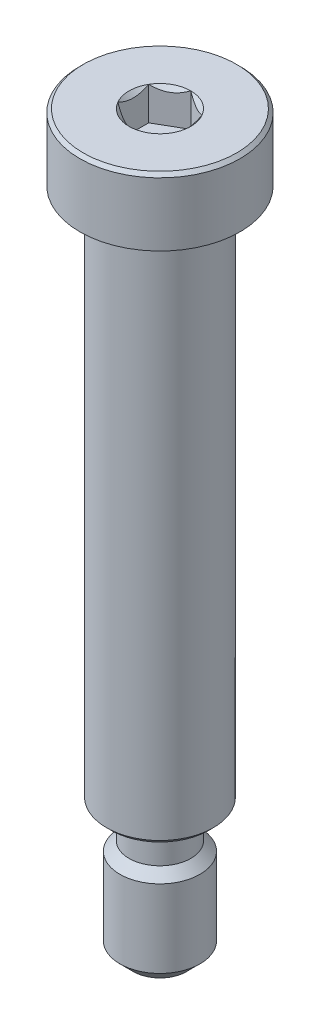
ISO-10303-21;
HEADER;
FILE_DESCRIPTION(('STEP AP214'),'2;1');
FILE_NAME('part.step','',(''),(''),'','','');
FILE_SCHEMA(('AUTOMOTIVE_DESIGN { 1 0 10303 214 1 1 1 1 }'));
ENDSEC;
DATA;
#1=APPLICATION_CONTEXT('core data for automotive mechanical design processes');
#2=APPLICATION_PROTOCOL_DEFINITION('international standard','automotive_design',2000,#1);
#3=PRODUCT_CONTEXT('',#1,'mechanical');
#4=PRODUCT('Part','Part','',(#3));
#5=PRODUCT_RELATED_PRODUCT_CATEGORY('part','',(#4));
#6=PRODUCT_DEFINITION_FORMATION('','',#4);
#7=PRODUCT_DEFINITION_CONTEXT('part definition',#1,'design');
#8=PRODUCT_DEFINITION('design','',#6,#7);
#9=PRODUCT_DEFINITION_SHAPE('','',#8);
#10=(LENGTH_UNIT() NAMED_UNIT(*) SI_UNIT(.MILLI.,.METRE.));
#11=(NAMED_UNIT(*) PLANE_ANGLE_UNIT() SI_UNIT($,.RADIAN.));
#12=(NAMED_UNIT(*) SI_UNIT($,.STERADIAN.) SOLID_ANGLE_UNIT());
#13=UNCERTAINTY_MEASURE_WITH_UNIT(LENGTH_MEASURE(1.E-05),#10,'distance_accuracy_value','');
#14=(GEOMETRIC_REPRESENTATION_CONTEXT(3) GLOBAL_UNCERTAINTY_ASSIGNED_CONTEXT((#13)) GLOBAL_UNIT_ASSIGNED_CONTEXT((#10,
#11,#12)) REPRESENTATION_CONTEXT('',''));
#15=CARTESIAN_POINT('',(0.,0.,0.));
#16=DIRECTION('',(0.,0.,1.));
#17=DIRECTION('',(1.,0.,0.));
#18=AXIS2_PLACEMENT_3D('',#15,#16,#17);
#19=CARTESIAN_POINT('',(0.,-79.375,0.));
#20=DIRECTION('',(0.,1.,0.));
#21=DIRECTION('',(0.,0.,1.));
#22=AXIS2_PLACEMENT_3D('',#19,#20,#21);
#23=CYLINDRICAL_SURFACE('',#22,4.7625);
#24=CARTESIAN_POINT('',(0.,-63.5,0.));
#25=DIRECTION('',(0.,-1.,0.));
#26=DIRECTION('',(0.,0.,-1.));
#27=AXIS2_PLACEMENT_3D('',#24,#25,#26);
#28=CIRCLE('',#27,4.7625);
#29=CARTESIAN_POINT('',(0.,-63.5,-4.7625));
#30=VERTEX_POINT('',#29);
#31=EDGE_CURVE('E244',#30,#30,#28,.T.);
#32=ORIENTED_EDGE('',*,*,#31,.T.);
#33=EDGE_LOOP('',(#32));
#34=FACE_BOUND('',#33,.T.);
#35=CARTESIAN_POINT('',(0.,-63.5042322831476,0.));
#36=DIRECTION('',(0.,-1.,0.));
#37=DIRECTION('',(1.,0.,0.));
#38=AXIS2_PLACEMENT_3D('',#35,#36,#37);
#39=CIRCLE('',#38,4.7625);
#40=CARTESIAN_POINT('',(4.76250000000001,-63.5042322831476,0.));
#41=VERTEX_POINT('',#40);
#42=EDGE_CURVE('E240',#41,#41,#39,.T.);
#43=ORIENTED_EDGE('',*,*,#42,.F.);
#44=EDGE_LOOP('',(#43));
#45=FACE_BOUND('',#44,.T.);
#46=ADVANCED_FACE('F34',(#34,#45),#23,.T.);
#47=CARTESIAN_POINT('',(0.,-63.5,0.));
#48=DIRECTION('',(0.,-1.,0.));
#49=DIRECTION('',(0.,0.,-1.));
#50=AXIS2_PLACEMENT_3D('',#47,#48,#49);
#51=PLANE('',#50);
#52=CARTESIAN_POINT('',(0.,-63.5,0.));
#53=DIRECTION('',(0.,-1.,0.));
#54=DIRECTION('',(0.,0.,-1.));
#55=AXIS2_PLACEMENT_3D('',#52,#53,#54);
#56=CIRCLE('',#55,5.82083333333334);
#57=CARTESIAN_POINT('',(0.,-63.5,-5.82083333333334));
#58=VERTEX_POINT('',#57);
#59=EDGE_CURVE('E251',#58,#58,#56,.T.);
#60=ORIENTED_EDGE('',*,*,#59,.T.);
#61=EDGE_LOOP('',(#60));
#62=FACE_BOUND('',#61,.T.);
#63=ORIENTED_EDGE('',*,*,#31,.F.);
#64=EDGE_LOOP('',(#63));
#65=FACE_BOUND('',#64,.T.);
#66=ADVANCED_FACE('F208',(#62,#65),#51,.T.);
#67=CARTESIAN_POINT('',(0.,7.9375,0.));
#68=DIRECTION('',(0.,-1.,0.));
#69=DIRECTION('',(0.,0.,-1.));
#70=AXIS2_PLACEMENT_3D('',#67,#68,#69);
#71=CYLINDRICAL_SURFACE('',#70,9.525);
#72=CARTESIAN_POINT('',(0.,7.540625,0.));
#73=DIRECTION('',(0.,1.,0.));
#74=DIRECTION('',(0.,0.,1.));
#75=AXIS2_PLACEMENT_3D('',#72,#73,#74);
#76=CIRCLE('',#75,9.525);
#77=CARTESIAN_POINT('',(0.,7.540625,9.525));
#78=VERTEX_POINT('',#77);
#79=EDGE_CURVE('E11',#78,#78,#76,.F.);
#80=ORIENTED_EDGE('',*,*,#79,.T.);
#81=EDGE_LOOP('',(#80));
#82=FACE_BOUND('',#81,.T.);
#83=CARTESIAN_POINT('',(0.,0.,0.));
#84=DIRECTION('',(0.,1.,0.));
#85=DIRECTION('',(0.,0.,1.));
#86=AXIS2_PLACEMENT_3D('',#83,#84,#85);
#87=CIRCLE('',#86,9.525);
#88=CARTESIAN_POINT('',(0.,0.,9.525));
#89=VERTEX_POINT('',#88);
#90=EDGE_CURVE('E106',#89,#89,#87,.T.);
#91=ORIENTED_EDGE('',*,*,#90,.T.);
#92=EDGE_LOOP('',(#91));
#93=FACE_BOUND('',#92,.T.);
#94=ADVANCED_FACE('F215',(#82,#93),#71,.T.);
#95=CARTESIAN_POINT('',(0.,7.9375,0.));
#96=DIRECTION('',(0.,1.,0.));
#97=DIRECTION('',(0.,0.,1.));
#98=AXIS2_PLACEMENT_3D('',#95,#96,#97);
#99=PLANE('',#98);
#100=CARTESIAN_POINT('',(0.,7.9375,0.));
#101=DIRECTION('',(0.,1.,0.));
#102=DIRECTION('',(0.,0.,1.));
#103=AXIS2_PLACEMENT_3D('',#100,#101,#102);
#104=CIRCLE('',#103,9.128125);
#105=CARTESIAN_POINT('',(0.,7.9375,9.128125));
#106=VERTEX_POINT('',#105);
#107=EDGE_CURVE('E42',#106,#106,#104,.T.);
#108=ORIENTED_EDGE('',*,*,#107,.T.);
#109=EDGE_LOOP('',(#108));
#110=FACE_BOUND('',#109,.T.);
#111=CARTESIAN_POINT('',(0.,7.9375,0.));
#112=DIRECTION('',(0.,1.,0.));
#113=DIRECTION('',(0.,0.,1.));
#114=AXIS2_PLACEMENT_3D('',#111,#112,#113);
#115=CIRCLE('',#114,3.66617420935412);
#116=CARTESIAN_POINT('',(0.,7.9375,3.66617420935412));
#117=VERTEX_POINT('',#116);
#118=CARTESIAN_POINT('',(3.175,7.9375,1.83308710467706));
#119=VERTEX_POINT('',#118);
#120=EDGE_CURVE('E55',#117,#119,#115,.T.);
#121=ORIENTED_EDGE('',*,*,#120,.F.);
#122=CARTESIAN_POINT('',(-3.175,7.9375,1.83308710467706));
#123=VERTEX_POINT('',#122);
#124=EDGE_CURVE('E130',#123,#117,#115,.T.);
#125=ORIENTED_EDGE('',*,*,#124,.F.);
#126=CARTESIAN_POINT('',(-3.175,7.9375,-1.83308710467706));
#127=VERTEX_POINT('',#126);
#128=EDGE_CURVE('E129',#127,#123,#115,.T.);
#129=ORIENTED_EDGE('',*,*,#128,.F.);
#130=CARTESIAN_POINT('',(0.,7.9375,-3.66617420935412));
#131=VERTEX_POINT('',#130);
#132=EDGE_CURVE('E95',#131,#127,#115,.T.);
#133=ORIENTED_EDGE('',*,*,#132,.F.);
#134=CARTESIAN_POINT('',(3.175,7.9375,-1.83308710467706));
#135=VERTEX_POINT('',#134);
#136=EDGE_CURVE('E87',#135,#131,#115,.T.);
#137=ORIENTED_EDGE('',*,*,#136,.F.);
#138=EDGE_CURVE('E48',#119,#135,#115,.T.);
#139=ORIENTED_EDGE('',*,*,#138,.F.);
#140=EDGE_LOOP('',(#121,#125,#129,#133,#137,#139));
#141=FACE_BOUND('',#140,.T.);
#142=ADVANCED_FACE('F126',(#110,#141),#99,.T.);
#143=CARTESIAN_POINT('',(0.,0.,0.));
#144=DIRECTION('',(0.,1.,0.));
#145=DIRECTION('',(0.,0.,1.));
#146=AXIS2_PLACEMENT_3D('',#143,#144,#145);
#147=PLANE('',#146);
#148=CARTESIAN_POINT('',(0.,0.,0.));
#149=DIRECTION('',(0.,-1.,0.));
#150=DIRECTION('',(0.,0.,-1.));
#151=AXIS2_PLACEMENT_3D('',#148,#149,#150);
#152=CIRCLE('',#151,6.35);
#153=CARTESIAN_POINT('',(0.,0.,-6.35));
#154=VERTEX_POINT('',#153);
#155=EDGE_CURVE('E134',#154,#154,#152,.T.);
#156=ORIENTED_EDGE('',*,*,#155,.F.);
#157=EDGE_LOOP('',(#156));
#158=FACE_BOUND('',#157,.T.);
#159=ORIENTED_EDGE('',*,*,#90,.F.);
#160=EDGE_LOOP('',(#159));
#161=FACE_BOUND('',#160,.T.);
#162=ADVANCED_FACE('F400',(#158,#161),#147,.F.);
#163=CARTESIAN_POINT('',(0.,7.9375,0.));
#164=DIRECTION('',(0.,1.,0.));
#165=DIRECTION('',(0.,0.,1.));
#166=AXIS2_PLACEMENT_3D('',#163,#164,#165);
#167=CONICAL_SURFACE('',#166,3.66617420935412,0.78539816339745);
#168=ORIENTED_EDGE('',*,*,#132,.T.);
#169=CARTESIAN_POINT('',(0.000199999999998715,7.93761547550894,-3.66628967940796));
#170=CARTESIAN_POINT('',(-0.108938349949827,7.87465898369178,-3.60327862368552));
#171=CARTESIAN_POINT('',(-0.219901628077946,7.81540010423474,-3.53921394518808));
#172=CARTESIAN_POINT('',(-0.446167846345947,7.70689865573056,-3.40857908316254));
#173=CARTESIAN_POINT('',(-0.561492303252263,7.65771645393871,-3.34199647692353));
#174=CARTESIAN_POINT('',(-0.794038522480625,7.573466458874,-3.207735854653));
#175=CARTESIAN_POINT('',(-0.911201066281149,7.53818691449945,-3.14009202845083));
#176=CARTESIAN_POINT('',(-1.14810544464628,7.48383157013482,-3.00331522182952));
#177=CARTESIAN_POINT('',(-1.26784004264355,7.46471519752964,-2.93418641944448));
#178=CARTESIAN_POINT('',(-1.47419791875158,7.44746713062325,-2.81504564412411));
#179=CARTESIAN_POINT('',(-1.56055470772915,7.44491393361382,-2.76518752876156));
#180=CARTESIAN_POINT('',(-1.73312781652471,7.44921627312326,-2.66555239794355));
#181=CARTESIAN_POINT('',(-1.8193440764928,7.45607510802144,-2.61577541704245));
#182=CARTESIAN_POINT('',(-1.99095979158713,7.4788098833037,-2.51669303773557));
#183=CARTESIAN_POINT('',(-2.07635822425327,7.49469590968728,-2.4673882296474));
#184=CARTESIAN_POINT('',(-2.24568840330547,7.53461798399795,-2.36962540518969));
#185=CARTESIAN_POINT('',(-2.32962026161975,7.55865340708517,-2.32116732419836));
#186=CARTESIAN_POINT('',(-2.47862357928411,7.60810523441716,-2.23514021863469));
#187=CARTESIAN_POINT('',(-2.54402485119173,7.63222171930099,-2.19738077669348));
#188=CARTESIAN_POINT('',(-2.67365325020511,7.68434146713715,-2.12253978562849));
#189=CARTESIAN_POINT('',(-2.73788034144172,7.71234484860353,-2.08545825721376));
#190=CARTESIAN_POINT('',(-2.8649580345126,7.77161056554451,-2.01208991691129));
#191=CARTESIAN_POINT('',(-2.92781225074872,7.80286265335421,-1.97580101824766));
#192=CARTESIAN_POINT('',(-3.05235662084809,7.86821534439193,-1.90389529264474));
#193=CARTESIAN_POINT('',(-3.11404746097871,7.90231419951854,-1.86827806948879));
#194=CARTESIAN_POINT('',(-3.1752,7.93761547550894,-1.83297163462322));
#195=B_SPLINE_CURVE_WITH_KNOTS('',3,(#169,#170,#171,#172,#173,#174,#175,#176,#177,#178,#179,
#180,#181,#182,#183,#184,#185,#186,#187,#188,#189,#190,#191,#192,#193,#194),.UNSPECIFIED.,.F.,
.F.,(4,2,2,2,2,2,2,2,2,2,2,2,4),(0.,0.422910572436807,0.848285055427806,1.26690402276127,
1.68446903107506,1.98329272958351,2.2822211754689,2.58148426995465,2.88072442418451,
3.11844134429546,3.35616551414405,3.59316134346766,3.83001269744429),.UNSPECIFIED.);
#196=EDGE_CURVE('E100',#131,#127,#195,.T.);
#197=ORIENTED_EDGE('',*,*,#196,.F.);
#198=EDGE_LOOP('',(#168,#197));
#199=FACE_BOUND('',#198,.T.);
#200=ADVANCED_FACE('F101',(#199),#167,.F.);
#201=ORIENTED_EDGE('',*,*,#128,.T.);
#202=CARTESIAN_POINT('',(-3.175,8.99520369961384,-3.49777036107798));
#203=CARTESIAN_POINT('',(-3.175,8.93160162531257,-3.41185351747915));
#204=CARTESIAN_POINT('',(-3.175,8.86866125375686,-3.32543845851566));
#205=CARTESIAN_POINT('',(-3.175,8.74439421336915,-3.15142240756836));
#206=CARTESIAN_POINT('',(-3.175,8.6830679776502,-3.06382110664582));
#207=CARTESIAN_POINT('',(-3.175,8.56188558427659,-2.88660407918384));
#208=CARTESIAN_POINT('',(-3.175,8.50204451400587,-2.79697799945208));
#209=CARTESIAN_POINT('',(-3.175,8.38475317061914,-2.61617950744609));
#210=CARTESIAN_POINT('',(-3.175,8.32730272356863,-2.52500720835187));
#211=CARTESIAN_POINT('',(-3.175,8.2124324313803,-2.33615109320517));
#212=CARTESIAN_POINT('',(-3.175,8.15516599624618,-2.23837348539621));
#213=CARTESIAN_POINT('',(-3.175,8.04462077200859,-2.04055386532052));
#214=CARTESIAN_POINT('',(-3.175,7.99134266036117,-1.94051147209944));
#215=CARTESIAN_POINT('',(-3.175,7.88994212127888,-1.73821620522712));
#216=CARTESIAN_POINT('',(-3.175,7.84180419911621,-1.6359711596194));
#217=CARTESIAN_POINT('',(-3.175,7.75174978873241,-1.42878409167596));
#218=CARTESIAN_POINT('',(-3.175,7.70983137866185,-1.32384291426178));
#219=CARTESIAN_POINT('',(-3.175,7.63602565680179,-1.11770217875831));
#220=CARTESIAN_POINT('',(-3.175,7.60368058955801,-1.01666827859361));
#221=CARTESIAN_POINT('',(-3.175,7.54712119127079,-0.812306588419582));
#222=CARTESIAN_POINT('',(-3.175,7.52290746724818,-0.708978627767683));
#223=CARTESIAN_POINT('',(-3.175,7.48423721095156,-0.502291088296213));
#224=CARTESIAN_POINT('',(-3.175,7.46962275371737,-0.398961533288926));
#225=CARTESIAN_POINT('',(-3.175,7.45041014576881,-0.191370983762266));
#226=CARTESIAN_POINT('',(-3.175,7.44581056767828,-0.0871101241047789));
#227=CARTESIAN_POINT('',(-3.175,7.44691649491753,0.118225105111013));
#228=CARTESIAN_POINT('',(-3.175,7.45231710556286,0.21930127075547));
#229=CARTESIAN_POINT('',(-3.175,7.47248589256745,0.420508629839324));
#230=CARTESIAN_POINT('',(-3.175,7.48725502370013,0.520639725908214));
#231=CARTESIAN_POINT('',(-3.175,7.5256342754121,0.720923459793612));
#232=CARTESIAN_POINT('',(-3.175,7.54938964901744,0.821047839628115));
#233=CARTESIAN_POINT('',(-3.175,7.6045221397412,1.01913191673953));
#234=CARTESIAN_POINT('',(-3.175,7.63589843825639,1.1170918452793));
#235=CARTESIAN_POINT('',(-3.175,7.70962924077272,1.32355745229036));
#236=CARTESIAN_POINT('',(-3.175,7.7528880801131,1.43173730319367));
#237=CARTESIAN_POINT('',(-3.175,7.84598518904404,1.64523596826605));
#238=CARTESIAN_POINT('',(-3.175,7.89582577223603,1.75055376059988));
#239=CARTESIAN_POINT('',(-3.175,8.00090274785494,1.95888658964307));
#240=CARTESIAN_POINT('',(-3.175,8.05615677118685,2.06189266220424));
#241=CARTESIAN_POINT('',(-3.175,8.1708303110691,2.26552135685404));
#242=CARTESIAN_POINT('',(-3.175,8.23024913945364,2.36614436904551));
#243=CARTESIAN_POINT('',(-3.175,8.34934693008608,2.56031406522809));
#244=CARTESIAN_POINT('',(-3.175,8.4088619425535,2.6539618438625));
#245=CARTESIAN_POINT('',(-3.175,8.53035388120396,2.83965181917168));
#246=CARTESIAN_POINT('',(-3.175,8.59233099581655,2.93169389217982));
#247=CARTESIAN_POINT('',(-3.175,8.71778495380937,3.11362922655354));
#248=CARTESIAN_POINT('',(-3.175,8.78124524746769,3.20353394064091));
#249=CARTESIAN_POINT('',(-3.175,8.90981361559042,3.38212136637414));
#250=CARTESIAN_POINT('',(-3.175,8.97492123418763,3.47080440582776));
#251=CARTESIAN_POINT('',(-3.175,9.0407012939609,3.55897705691137));
#252=B_SPLINE_CURVE_WITH_KNOTS('',3,(#202,#203,#204,#205,#206,#207,#208,#209,#210,#211,#212,
#213,#214,#215,#216,#217,#218,#219,#220,#221,#222,#223,#224,#225,#226,#227,#228,#229,#230,#231,
#232,#233,#234,#235,#236,#237,#238,#239,#240,#241,#242,#243,#244,#245,#246,#247,#248,#249,#250,
#251),.UNSPECIFIED.,.F.,.F.,(4,2,2,2,2,2,2,2,2,2,2,2,2,2,2,2,2,2,2,2,2,2,2,2,4),(0.,
0.320697227131731,0.641479645775138,0.964749568744561,1.28799593030476,1.62786016473245,
1.96778199806988,2.30664837524686,2.64540982255861,2.96337986486636,3.28137363899217,
3.59399530687801,3.90657241527076,4.20977589426355,4.51301027857855,4.82137145114127,
5.12969951566147,5.47894757824494,5.82831873623607,6.178868176975,6.52935983108851,
6.86219199504095,7.19504968055625,7.52516675007628,7.85519344386229),.UNSPECIFIED.);
#253=EDGE_CURVE('E133',#127,#123,#252,.T.);
#254=ORIENTED_EDGE('',*,*,#253,.F.);
#255=EDGE_LOOP('',(#201,#254));
#256=FACE_BOUND('',#255,.T.);
#257=ADVANCED_FACE('F304',(#256),#167,.F.);
#258=ORIENTED_EDGE('',*,*,#124,.T.);
#259=CARTESIAN_POINT('',(-3.1752,7.93761547550895,1.83297163462322));
#260=CARTESIAN_POINT('',(-3.06606165005017,7.87465898369178,1.89598269034567));
#261=CARTESIAN_POINT('',(-2.95509837192205,7.81540010423474,1.9600473688431));
#262=CARTESIAN_POINT('',(-2.72883215365405,7.70689865573056,2.09068223086865));
#263=CARTESIAN_POINT('',(-2.61350769674774,7.65771645393871,2.15726483710766));
#264=CARTESIAN_POINT('',(-2.38096147751937,7.573466458874,2.29152545937818));
#265=CARTESIAN_POINT('',(-2.26379893371885,7.53818691449945,2.35916928558036));
#266=CARTESIAN_POINT('',(-2.02689455535372,7.48383157013482,2.49594609220167));
#267=CARTESIAN_POINT('',(-1.90715995735645,7.46471519752964,2.5650748945867));
#268=CARTESIAN_POINT('',(-1.70080208124842,7.44746713062325,2.68421566990707));
#269=CARTESIAN_POINT('',(-1.61444529227084,7.44491393361382,2.73407378526963));
#270=CARTESIAN_POINT('',(-1.44187218347528,7.44921627312326,2.83370891608763));
#271=CARTESIAN_POINT('',(-1.3556559235072,7.45607510802144,2.88348589698873));
#272=CARTESIAN_POINT('',(-1.18404020841287,7.4788098833037,2.98256827629561));
#273=CARTESIAN_POINT('',(-1.09864177574673,7.49469590968728,3.03187308438378));
#274=CARTESIAN_POINT('',(-0.929311596694526,7.53461798399795,3.1296359088415));
#275=CARTESIAN_POINT('',(-0.845379738380251,7.55865340708517,3.17809398983283));
#276=CARTESIAN_POINT('',(-0.696376420715884,7.60810523441716,3.2641210953965));
#277=CARTESIAN_POINT('',(-0.630975148808267,7.63222171930099,3.3018805373377));
#278=CARTESIAN_POINT('',(-0.501346749794892,7.68434146713715,3.3767215284027));
#279=CARTESIAN_POINT('',(-0.437119658558276,7.71234484860352,3.41380305681742));
#280=CARTESIAN_POINT('',(-0.310041965487399,7.77161056554451,3.48717139711989));
#281=CARTESIAN_POINT('',(-0.247187749251275,7.80286265335421,3.52346029578352));
#282=CARTESIAN_POINT('',(-0.122643379151906,7.86821534439193,3.59536602138644));
#283=CARTESIAN_POINT('',(-0.0609525390212896,7.90231419951854,3.63098324454239));
#284=CARTESIAN_POINT('',(0.000200000000000959,7.93761547550894,3.66628967940796));
#285=B_SPLINE_CURVE_WITH_KNOTS('',3,(#259,#260,#261,#262,#263,#264,#265,#266,#267,#268,#269,
#270,#271,#272,#273,#274,#275,#276,#277,#278,#279,#280,#281,#282,#283,#284),.UNSPECIFIED.,.F.,
.F.,(4,2,2,2,2,2,2,2,2,2,2,2,4),(0.,0.422910572436809,0.84828505542781,1.26690402276127,
1.68446903107506,1.98329272958352,2.2822211754689,2.58148426995466,2.88072442418452,
3.11844134429546,3.35616551414405,3.59316134346767,3.8300126974443),.UNSPECIFIED.);
#286=EDGE_CURVE('E144',#123,#117,#285,.T.);
#287=ORIENTED_EDGE('',*,*,#286,.F.);
#288=EDGE_LOOP('',(#258,#287));
#289=FACE_BOUND('',#288,.T.);
#290=ADVANCED_FACE('F302',(#289),#167,.F.);
#291=ORIENTED_EDGE('',*,*,#120,.T.);
#292=CARTESIAN_POINT('',(-0.000199999999998962,7.93761547550894,3.66628967940796));
#293=CARTESIAN_POINT('',(0.108938349949826,7.87465898369178,3.60327862368552));
#294=CARTESIAN_POINT('',(0.219901628077945,7.81540010423474,3.53921394518808));
#295=CARTESIAN_POINT('',(0.446167846345946,7.70689865573056,3.40857908316254));
#296=CARTESIAN_POINT('',(0.561492303252262,7.65771645393871,3.34199647692353));
#297=CARTESIAN_POINT('',(0.794038522480625,7.573466458874,3.207735854653));
#298=CARTESIAN_POINT('',(0.911201066281148,7.53818691449945,3.14009202845083));
#299=CARTESIAN_POINT('',(1.14810544464628,7.48383157013482,3.00331522182952));
#300=CARTESIAN_POINT('',(1.26784004264355,7.46471519752964,2.93418641944448));
#301=CARTESIAN_POINT('',(1.47419791875158,7.44746713062325,2.81504564412411));
#302=CARTESIAN_POINT('',(1.56055470772915,7.44491393361382,2.76518752876156));
#303=CARTESIAN_POINT('',(1.73312781652471,7.44921627312326,2.66555239794355));
#304=CARTESIAN_POINT('',(1.8193440764928,7.45607510802144,2.61577541704245));
#305=CARTESIAN_POINT('',(1.99095979158713,7.4788098833037,2.51669303773558));
#306=CARTESIAN_POINT('',(2.07635822425327,7.49469590968728,2.4673882296474));
#307=CARTESIAN_POINT('',(2.24568840330547,7.53461798399795,2.36962540518969));
#308=CARTESIAN_POINT('',(2.32962026161975,7.55865340708517,2.32116732419836));
#309=CARTESIAN_POINT('',(2.47862357928411,7.60810523441716,2.23514021863469));
#310=CARTESIAN_POINT('',(2.54402485119173,7.63222171930099,2.19738077669348));
#311=CARTESIAN_POINT('',(2.6736532502051,7.68434146713715,2.12253978562849));
#312=CARTESIAN_POINT('',(2.73788034144172,7.71234484860353,2.08545825721376));
#313=CARTESIAN_POINT('',(2.8649580345126,7.77161056554451,2.01208991691129));
#314=CARTESIAN_POINT('',(2.92781225074872,7.80286265335421,1.97580101824766));
#315=CARTESIAN_POINT('',(3.05235662084809,7.86821534439193,1.90389529264474));
#316=CARTESIAN_POINT('',(3.11404746097871,7.90231419951854,1.86827806948879));
#317=CARTESIAN_POINT('',(3.1752,7.93761547550894,1.83297163462322));
#318=B_SPLINE_CURVE_WITH_KNOTS('',3,(#292,#293,#294,#295,#296,#297,#298,#299,#300,#301,#302,
#303,#304,#305,#306,#307,#308,#309,#310,#311,#312,#313,#314,#315,#316,#317),.UNSPECIFIED.,.F.,
.F.,(4,2,2,2,2,2,2,2,2,2,2,2,4),(0.,0.422910572436807,0.848285055427806,1.26690402276127,
1.68446903107506,1.98329272958351,2.2822211754689,2.58148426995465,2.88072442418451,
3.11844134429546,3.35616551414405,3.59316134346766,3.8300126974443),.UNSPECIFIED.);
#319=EDGE_CURVE('E174',#117,#119,#318,.T.);
#320=ORIENTED_EDGE('',*,*,#319,.F.);
#321=EDGE_LOOP('',(#291,#320));
#322=FACE_BOUND('',#321,.T.);
#323=ADVANCED_FACE('F430',(#322),#167,.F.);
#324=ORIENTED_EDGE('',*,*,#138,.T.);
#325=CARTESIAN_POINT('',(3.175,8.99520369961384,-3.49777036107798));
#326=CARTESIAN_POINT('',(3.175,8.93160162531257,-3.41185351747915));
#327=CARTESIAN_POINT('',(3.175,8.86866125375686,-3.32543845851566));
#328=CARTESIAN_POINT('',(3.175,8.74439421336915,-3.15142240756837));
#329=CARTESIAN_POINT('',(3.175,8.6830679776502,-3.06382110664582));
#330=CARTESIAN_POINT('',(3.175,8.56188558427659,-2.88660407918385));
#331=CARTESIAN_POINT('',(3.175,8.50204451400588,-2.79697799945208));
#332=CARTESIAN_POINT('',(3.175,8.38475317061914,-2.6161795074461));
#333=CARTESIAN_POINT('',(3.175,8.32730272356864,-2.52500720835187));
#334=CARTESIAN_POINT('',(3.175,8.2124324313803,-2.33615109320517));
#335=CARTESIAN_POINT('',(3.175,8.15516599624618,-2.23837348539621));
#336=CARTESIAN_POINT('',(3.175,8.0446207720086,-2.04055386532052));
#337=CARTESIAN_POINT('',(3.175,7.99134266036117,-1.94051147209944));
#338=CARTESIAN_POINT('',(3.175,7.88994212127888,-1.73821620522712));
#339=CARTESIAN_POINT('',(3.175,7.84180419911621,-1.6359711596194));
#340=CARTESIAN_POINT('',(3.175,7.75174978873241,-1.42878409167596));
#341=CARTESIAN_POINT('',(3.175,7.70983137866185,-1.32384291426178));
#342=CARTESIAN_POINT('',(3.175,7.63602565680179,-1.11770217875831));
#343=CARTESIAN_POINT('',(3.175,7.60368058955801,-1.01666827859361));
#344=CARTESIAN_POINT('',(3.175,7.54712119127079,-0.812306588419583));
#345=CARTESIAN_POINT('',(3.175,7.52290746724818,-0.708978627767684));
#346=CARTESIAN_POINT('',(3.175,7.48423721095156,-0.502291088296214));
#347=CARTESIAN_POINT('',(3.175,7.46962275371737,-0.398961533288927));
#348=CARTESIAN_POINT('',(3.175,7.45041014576881,-0.191370983762267));
#349=CARTESIAN_POINT('',(3.175,7.44581056767828,-0.0871101241047795));
#350=CARTESIAN_POINT('',(3.175,7.44691649491753,0.118225105111012));
#351=CARTESIAN_POINT('',(3.175,7.45231710556286,0.21930127075547));
#352=CARTESIAN_POINT('',(3.175,7.47248589256745,0.420508629839324));
#353=CARTESIAN_POINT('',(3.175,7.48725502370013,0.520639725908214));
#354=CARTESIAN_POINT('',(3.175,7.5256342754121,0.720923459793612));
#355=CARTESIAN_POINT('',(3.175,7.54938964901744,0.821047839628115));
#356=CARTESIAN_POINT('',(3.175,7.6045221397412,1.01913191673953));
#357=CARTESIAN_POINT('',(3.175,7.63589843825639,1.1170918452793));
#358=CARTESIAN_POINT('',(3.175,7.70962924077272,1.32355745229036));
#359=CARTESIAN_POINT('',(3.175,7.7528880801131,1.43173730319367));
#360=CARTESIAN_POINT('',(3.175,7.84598518904404,1.64523596826605));
#361=CARTESIAN_POINT('',(3.175,7.89582577223603,1.75055376059988));
#362=CARTESIAN_POINT('',(3.175,8.00090274785494,1.95888658964307));
#363=CARTESIAN_POINT('',(3.175,8.05615677118685,2.06189266220424));
#364=CARTESIAN_POINT('',(3.175,8.1708303110691,2.26552135685403));
#365=CARTESIAN_POINT('',(3.175,8.23024913945364,2.36614436904551));
#366=CARTESIAN_POINT('',(3.175,8.34934693008608,2.56031406522809));
#367=CARTESIAN_POINT('',(3.175,8.40886194255349,2.6539618438625));
#368=CARTESIAN_POINT('',(3.175,8.53035388120395,2.83965181917167));
#369=CARTESIAN_POINT('',(3.175,8.59233099581655,2.93169389217981));
#370=CARTESIAN_POINT('',(3.175,8.71778495380937,3.11362922655354));
#371=CARTESIAN_POINT('',(3.175,8.78124524746769,3.20353394064091));
#372=CARTESIAN_POINT('',(3.175,8.90981361559041,3.38212136637414));
#373=CARTESIAN_POINT('',(3.175,8.97492123418763,3.47080440582776));
#374=CARTESIAN_POINT('',(3.175,9.0407012939609,3.55897705691136));
#375=B_SPLINE_CURVE_WITH_KNOTS('',3,(#325,#326,#327,#328,#329,#330,#331,#332,#333,#334,#335,
#336,#337,#338,#339,#340,#341,#342,#343,#344,#345,#346,#347,#348,#349,#350,#351,#352,#353,#354,
#355,#356,#357,#358,#359,#360,#361,#362,#363,#364,#365,#366,#367,#368,#369,#370,#371,#372,#373,
#374),.UNSPECIFIED.,.F.,.F.,(4,2,2,2,2,2,2,2,2,2,2,2,2,2,2,2,2,2,2,2,2,2,2,2,4),(0.,
0.320697227131732,0.641479645775138,0.964749568744559,1.28799593030476,1.62786016473245,
1.96778199806988,2.30664837524686,2.64540982255861,2.96337986486637,3.28137363899217,
3.59399530687801,3.90657241527076,4.20977589426356,4.51301027857856,4.82137145114127,
5.12969951566147,5.47894757824494,5.82831873623607,6.178868176975,6.52935983108851,
6.86219199504095,7.19504968055625,7.52516675007628,7.85519344386229),.UNSPECIFIED.);
#376=EDGE_CURVE('E116',#119,#135,#375,.F.);
#377=ORIENTED_EDGE('',*,*,#376,.F.);
#378=EDGE_LOOP('',(#324,#377));
#379=FACE_BOUND('',#378,.T.);
#380=ADVANCED_FACE('F159',(#379),#167,.F.);
#381=ORIENTED_EDGE('',*,*,#136,.T.);
#382=CARTESIAN_POINT('',(3.1752,7.93761547550895,-1.83297163462322));
#383=CARTESIAN_POINT('',(3.06606165005017,7.87465898369178,-1.89598269034567));
#384=CARTESIAN_POINT('',(2.95509837192206,7.81540010423475,-1.9600473688431));
#385=CARTESIAN_POINT('',(2.72883215365405,7.70689865573056,-2.09068223086865));
#386=CARTESIAN_POINT('',(2.61350769674774,7.65771645393871,-2.15726483710766));
#387=CARTESIAN_POINT('',(2.38096147751938,7.573466458874,-2.29152545937818));
#388=CARTESIAN_POINT('',(2.26379893371885,7.53818691449945,-2.35916928558036));
#389=CARTESIAN_POINT('',(2.02689455535372,7.48383157013482,-2.49594609220167));
#390=CARTESIAN_POINT('',(1.90715995735645,7.46471519752964,-2.5650748945867));
#391=CARTESIAN_POINT('',(1.70080208124842,7.44746713062325,-2.68421566990707));
#392=CARTESIAN_POINT('',(1.61444529227085,7.44491393361382,-2.73407378526963));
#393=CARTESIAN_POINT('',(1.44187218347529,7.44921627312326,-2.83370891608763));
#394=CARTESIAN_POINT('',(1.3556559235072,7.45607510802144,-2.88348589698873));
#395=CARTESIAN_POINT('',(1.18404020841287,7.4788098833037,-2.98256827629561));
#396=CARTESIAN_POINT('',(1.09864177574673,7.49469590968728,-3.03187308438378));
#397=CARTESIAN_POINT('',(0.929311596694528,7.53461798399795,-3.1296359088415));
#398=CARTESIAN_POINT('',(0.845379738380253,7.55865340708517,-3.17809398983283));
#399=CARTESIAN_POINT('',(0.696376420715885,7.60810523441716,-3.2641210953965));
#400=CARTESIAN_POINT('',(0.630975148808269,7.63222171930099,-3.3018805373377));
#401=CARTESIAN_POINT('',(0.501346749794893,7.68434146713715,-3.3767215284027));
#402=CARTESIAN_POINT('',(0.437119658558276,7.71234484860352,-3.41380305681742));
#403=CARTESIAN_POINT('',(0.310041965487399,7.77161056554451,-3.48717139711989));
#404=CARTESIAN_POINT('',(0.247187749251275,7.80286265335421,-3.52346029578352));
#405=CARTESIAN_POINT('',(0.122643379151906,7.86821534439193,-3.59536602138644));
#406=CARTESIAN_POINT('',(0.0609525390212895,7.90231419951854,-3.63098324454239));
#407=CARTESIAN_POINT('',(-0.000200000000001456,7.93761547550894,-3.66628967940796));
#408=B_SPLINE_CURVE_WITH_KNOTS('',3,(#382,#383,#384,#385,#386,#387,#388,#389,#390,#391,#392,
#393,#394,#395,#396,#397,#398,#399,#400,#401,#402,#403,#404,#405,#406,#407),.UNSPECIFIED.,.F.,
.F.,(4,2,2,2,2,2,2,2,2,2,2,2,4),(0.,0.422910572436808,0.848285055427807,1.26690402276127,
1.68446903107506,1.98329272958352,2.2822211754689,2.58148426995465,2.88072442418452,
3.11844134429546,3.35616551414405,3.59316134346767,3.8300126974443),.UNSPECIFIED.);
#409=EDGE_CURVE('E91',#135,#131,#408,.T.);
#410=ORIENTED_EDGE('',*,*,#409,.F.);
#411=EDGE_LOOP('',(#381,#410));
#412=FACE_BOUND('',#411,.T.);
#413=ADVANCED_FACE('F89',(#412),#167,.F.);
#414=CARTESIAN_POINT('',(3.175,3.96875,-1.83308710467706));
#415=DIRECTION('',(0.,-1.,0.));
#416=DIRECTION('',(0.,0.,-1.));
#417=AXIS2_PLACEMENT_3D('',#414,#415,#416);
#418=PLANE('',#417);
#419=DIRECTION('',(-0.866025403784439,0.,-0.5));
#420=VECTOR('',#419,1.);
#421=CARTESIAN_POINT('',(3.175,3.96875,-1.83308710467706));
#422=LINE('',#421,#420);
#423=CARTESIAN_POINT('',(3.175,3.96875,-1.83308710467706));
#424=VERTEX_POINT('',#423);
#425=CARTESIAN_POINT('',(0.,3.96875,-3.66617420935412));
#426=VERTEX_POINT('',#425);
#427=EDGE_CURVE('E115',#424,#426,#422,.T.);
#428=ORIENTED_EDGE('',*,*,#427,.T.);
#429=DIRECTION('',(-0.866025403784439,0.,0.5));
#430=VECTOR('',#429,1.);
#431=CARTESIAN_POINT('',(0.,3.96875,-3.66617420935412));
#432=LINE('',#431,#430);
#433=CARTESIAN_POINT('',(-3.175,3.96875,-1.83308710467706));
#434=VERTEX_POINT('',#433);
#435=EDGE_CURVE('E120',#426,#434,#432,.T.);
#436=ORIENTED_EDGE('',*,*,#435,.T.);
#437=DIRECTION('',(0.,0.,1.));
#438=VECTOR('',#437,1.);
#439=CARTESIAN_POINT('',(-3.175,3.96875,-1.83308710467706));
#440=LINE('',#439,#438);
#441=CARTESIAN_POINT('',(-3.175,3.96875,1.83308710467706));
#442=VERTEX_POINT('',#441);
#443=EDGE_CURVE('E291',#434,#442,#440,.T.);
#444=ORIENTED_EDGE('',*,*,#443,.T.);
#445=DIRECTION('',(0.866025403784439,0.,0.5));
#446=VECTOR('',#445,1.);
#447=CARTESIAN_POINT('',(-3.175,3.96875,1.83308710467706));
#448=LINE('',#447,#446);
#449=CARTESIAN_POINT('',(0.,3.96875,3.66617420935412));
#450=VERTEX_POINT('',#449);
#451=EDGE_CURVE('E288',#442,#450,#448,.T.);
#452=ORIENTED_EDGE('',*,*,#451,.T.);
#453=DIRECTION('',(0.866025403784439,0.,-0.5));
#454=VECTOR('',#453,1.);
#455=CARTESIAN_POINT('',(0.,3.96875,3.66617420935412));
#456=LINE('',#455,#454);
#457=CARTESIAN_POINT('',(3.175,3.96875,1.83308710467706));
#458=VERTEX_POINT('',#457);
#459=EDGE_CURVE('E285',#450,#458,#456,.T.);
#460=ORIENTED_EDGE('',*,*,#459,.T.);
#461=DIRECTION('',(0.,0.,-1.));
#462=VECTOR('',#461,1.);
#463=CARTESIAN_POINT('',(3.175,3.96875,1.83308710467706));
#464=LINE('',#463,#462);
#465=EDGE_CURVE('E123',#458,#424,#464,.T.);
#466=ORIENTED_EDGE('',*,*,#465,.T.);
#467=EDGE_LOOP('',(#428,#436,#444,#452,#460,#466));
#468=FACE_BOUND('',#467,.T.);
#469=ADVANCED_FACE('F158',(#468),#418,.F.);
#470=CARTESIAN_POINT('',(0.,3.96875,-3.66617420935412));
#471=DIRECTION('',(-0.5,0.,-0.866025403784438));
#472=DIRECTION('',(-0.866025403784439,0.,0.5));
#473=AXIS2_PLACEMENT_3D('',#470,#471,#472);
#474=PLANE('',#473);
#475=DIRECTION('',(0.,1.,0.));
#476=VECTOR('',#475,1.);
#477=CARTESIAN_POINT('',(0.,3.96875,-3.66617420935412));
#478=LINE('',#477,#476);
#479=EDGE_CURVE('E112',#426,#131,#478,.T.);
#480=ORIENTED_EDGE('',*,*,#479,.T.);
#481=ORIENTED_EDGE('',*,*,#196,.T.);
#482=DIRECTION('',(0.,1.,0.));
#483=VECTOR('',#482,1.);
#484=CARTESIAN_POINT('',(-3.175,3.96875,-1.83308710467706));
#485=LINE('',#484,#483);
#486=EDGE_CURVE('E122',#434,#127,#485,.T.);
#487=ORIENTED_EDGE('',*,*,#486,.F.);
#488=ORIENTED_EDGE('',*,*,#435,.F.);
#489=EDGE_LOOP('',(#480,#481,#487,#488));
#490=FACE_BOUND('',#489,.T.);
#491=ADVANCED_FACE('F118',(#490),#474,.F.);
#492=CARTESIAN_POINT('',(-3.175,3.96875,-1.83308710467706));
#493=DIRECTION('',(-1.,0.,0.));
#494=DIRECTION('',(0.,0.,1.));
#495=AXIS2_PLACEMENT_3D('',#492,#493,#494);
#496=PLANE('',#495);
#497=ORIENTED_EDGE('',*,*,#486,.T.);
#498=ORIENTED_EDGE('',*,*,#253,.T.);
#499=DIRECTION('',(0.,1.,0.));
#500=VECTOR('',#499,1.);
#501=CARTESIAN_POINT('',(-3.175,3.96875,1.83308710467706));
#502=LINE('',#501,#500);
#503=EDGE_CURVE('E276',#442,#123,#502,.T.);
#504=ORIENTED_EDGE('',*,*,#503,.F.);
#505=ORIENTED_EDGE('',*,*,#443,.F.);
#506=EDGE_LOOP('',(#497,#498,#504,#505));
#507=FACE_BOUND('',#506,.T.);
#508=ADVANCED_FACE('F151',(#507),#496,.F.);
#509=CARTESIAN_POINT('',(-3.175,3.96875,1.83308710467706));
#510=DIRECTION('',(-0.5,0.,0.866025403784439));
#511=DIRECTION('',(0.866025403784439,0.,0.5));
#512=AXIS2_PLACEMENT_3D('',#509,#510,#511);
#513=PLANE('',#512);
#514=ORIENTED_EDGE('',*,*,#503,.T.);
#515=ORIENTED_EDGE('',*,*,#286,.T.);
#516=DIRECTION('',(0.,1.,0.));
#517=VECTOR('',#516,1.);
#518=CARTESIAN_POINT('',(0.,3.96875,3.66617420935412));
#519=LINE('',#518,#517);
#520=EDGE_CURVE('E278',#450,#117,#519,.T.);
#521=ORIENTED_EDGE('',*,*,#520,.F.);
#522=ORIENTED_EDGE('',*,*,#451,.F.);
#523=EDGE_LOOP('',(#514,#515,#521,#522));
#524=FACE_BOUND('',#523,.T.);
#525=ADVANCED_FACE('F198',(#524),#513,.F.);
#526=CARTESIAN_POINT('',(0.,3.96875,3.66617420935412));
#527=DIRECTION('',(0.5,0.,0.866025403784439));
#528=DIRECTION('',(0.866025403784439,0.,-0.5));
#529=AXIS2_PLACEMENT_3D('',#526,#527,#528);
#530=PLANE('',#529);
#531=ORIENTED_EDGE('',*,*,#520,.T.);
#532=ORIENTED_EDGE('',*,*,#319,.T.);
#533=DIRECTION('',(0.,1.,0.));
#534=VECTOR('',#533,1.);
#535=CARTESIAN_POINT('',(3.175,3.96875,1.83308710467706));
#536=LINE('',#535,#534);
#537=EDGE_CURVE('E272',#458,#119,#536,.T.);
#538=ORIENTED_EDGE('',*,*,#537,.F.);
#539=ORIENTED_EDGE('',*,*,#459,.F.);
#540=EDGE_LOOP('',(#531,#532,#538,#539));
#541=FACE_BOUND('',#540,.T.);
#542=ADVANCED_FACE('F194',(#541),#530,.F.);
#543=CARTESIAN_POINT('',(3.175,3.96875,1.83308710467706));
#544=DIRECTION('',(1.,0.,0.));
#545=DIRECTION('',(0.,0.,-1.));
#546=AXIS2_PLACEMENT_3D('',#543,#544,#545);
#547=PLANE('',#546);
#548=ORIENTED_EDGE('',*,*,#537,.T.);
#549=ORIENTED_EDGE('',*,*,#376,.T.);
#550=DIRECTION('',(0.,1.,0.));
#551=VECTOR('',#550,1.);
#552=CARTESIAN_POINT('',(3.175,3.96875,-1.83308710467706));
#553=LINE('',#552,#551);
#554=EDGE_CURVE('E114',#424,#135,#553,.T.);
#555=ORIENTED_EDGE('',*,*,#554,.F.);
#556=ORIENTED_EDGE('',*,*,#465,.F.);
#557=EDGE_LOOP('',(#548,#549,#555,#556));
#558=FACE_BOUND('',#557,.T.);
#559=ADVANCED_FACE('F191',(#558),#547,.F.);
#560=CARTESIAN_POINT('',(3.175,3.96875,-1.83308710467706));
#561=DIRECTION('',(0.5,0.,-0.866025403784439));
#562=DIRECTION('',(-0.866025403784439,0.,-0.5));
#563=AXIS2_PLACEMENT_3D('',#560,#561,#562);
#564=PLANE('',#563);
#565=ORIENTED_EDGE('',*,*,#554,.T.);
#566=ORIENTED_EDGE('',*,*,#409,.T.);
#567=ORIENTED_EDGE('',*,*,#479,.F.);
#568=ORIENTED_EDGE('',*,*,#427,.F.);
#569=EDGE_LOOP('',(#565,#566,#567,#568));
#570=FACE_BOUND('',#569,.T.);
#571=ADVANCED_FACE('F110',(#570),#564,.F.);
#572=CARTESIAN_POINT('',(0.,0.,0.));
#573=DIRECTION('',(0.,-1.,0.));
#574=DIRECTION('',(0.,0.,-1.));
#575=AXIS2_PLACEMENT_3D('',#572,#573,#574);
#576=CYLINDRICAL_SURFACE('',#575,6.35);
#577=CARTESIAN_POINT('',(0.,-62.9708333333334,0.));
#578=DIRECTION('',(0.,-1.,0.));
#579=DIRECTION('',(0.,0.,-1.));
#580=AXIS2_PLACEMENT_3D('',#577,#578,#579);
#581=CIRCLE('',#580,6.35);
#582=CARTESIAN_POINT('',(0.,-62.9708333333334,-6.35));
#583=VERTEX_POINT('',#582);
#584=EDGE_CURVE('E254',#583,#583,#581,.F.);
#585=ORIENTED_EDGE('',*,*,#584,.T.);
#586=EDGE_LOOP('',(#585));
#587=FACE_BOUND('',#586,.T.);
#588=ORIENTED_EDGE('',*,*,#155,.T.);
#589=EDGE_LOOP('',(#588));
#590=FACE_BOUND('',#589,.T.);
#591=ADVANCED_FACE('F160',(#587,#590),#576,.T.);
#592=CARTESIAN_POINT('',(0.,-64.690625,0.));
#593=DIRECTION('',(0.,1.,0.));
#594=DIRECTION('',(-1.,0.,0.));
#595=AXIS2_PLACEMENT_3D('',#592,#593,#594);
#596=TOROIDAL_SURFACE('',#595,4.86280060829622,1.190625);
#597=CARTESIAN_POINT('',(0.,-64.690625,0.));
#598=DIRECTION('',(0.,1.,0.));
#599=DIRECTION('',(-1.,0.,0.));
#600=AXIS2_PLACEMENT_3D('',#597,#598,#599);
#601=CIRCLE('',#600,3.67217560829622);
#602=CARTESIAN_POINT('',(-3.67217560829621,-64.690625,0.));
#603=VERTEX_POINT('',#602);
#604=EDGE_CURVE('E241',#603,#603,#601,.T.);
#605=ORIENTED_EDGE('',*,*,#604,.T.);
#606=EDGE_LOOP('',(#605));
#607=FACE_BOUND('',#606,.T.);
#608=ORIENTED_EDGE('',*,*,#42,.T.);
#609=EDGE_LOOP('',(#608));
#610=FACE_BOUND('',#609,.T.);
#611=ADVANCED_FACE('F318',(#607,#610),#596,.F.);
#612=CARTESIAN_POINT('',(0.,-67.46875,0.));
#613=DIRECTION('',(0.,-1.,0.));
#614=DIRECTION('',(1.,0.,0.));
#615=AXIS2_PLACEMENT_3D('',#612,#613,#614);
#616=CONICAL_SURFACE('',#615,3.67217560829622,0.785398163397448);
#617=CARTESIAN_POINT('',(0.,-67.46875,0.));
#618=DIRECTION('',(0.,1.,0.));
#619=DIRECTION('',(-1.,0.,0.));
#620=AXIS2_PLACEMENT_3D('',#617,#618,#619);
#621=CIRCLE('',#620,3.67217560829622);
#622=CARTESIAN_POINT('',(-3.67217560829621,-67.46875,0.));
#623=VERTEX_POINT('',#622);
#624=EDGE_CURVE('E247',#623,#623,#621,.T.);
#625=ORIENTED_EDGE('',*,*,#624,.F.);
#626=EDGE_LOOP('',(#625));
#627=FACE_BOUND('',#626,.T.);
#628=CARTESIAN_POINT('',(0.,-68.5590743917038,0.));
#629=DIRECTION('',(0.,-1.,0.));
#630=DIRECTION('',(1.,0.,0.));
#631=AXIS2_PLACEMENT_3D('',#628,#629,#630);
#632=CIRCLE('',#631,4.7625);
#633=CARTESIAN_POINT('',(4.76250000000001,-68.5590743917038,0.));
#634=VERTEX_POINT('',#633);
#635=EDGE_CURVE('E238',#634,#634,#632,.F.);
#636=ORIENTED_EDGE('',*,*,#635,.T.);
#637=EDGE_LOOP('',(#636));
#638=FACE_BOUND('',#637,.T.);
#639=ADVANCED_FACE('F316',(#627,#638),#616,.T.);
#640=CARTESIAN_POINT('',(0.,0.,0.));
#641=DIRECTION('',(0.,1.,0.));
#642=DIRECTION('',(-1.,0.,0.));
#643=AXIS2_PLACEMENT_3D('',#640,#641,#642);
#644=CYLINDRICAL_SURFACE('',#643,3.67217560829622);
#645=ORIENTED_EDGE('',*,*,#624,.T.);
#646=EDGE_LOOP('',(#645));
#647=FACE_BOUND('',#646,.T.);
#648=ORIENTED_EDGE('',*,*,#604,.F.);
#649=EDGE_LOOP('',(#648));
#650=FACE_BOUND('',#649,.T.);
#651=ADVANCED_FACE('F313',(#647,#650),#644,.T.);
#652=CARTESIAN_POINT('',(0.,-79.375,0.));
#653=DIRECTION('',(0.,-1.,0.));
#654=DIRECTION('',(0.,0.,-1.));
#655=AXIS2_PLACEMENT_3D('',#652,#653,#654);
#656=PLANE('',#655);
#657=CARTESIAN_POINT('',(0.,-79.375,0.));
#658=DIRECTION('',(0.,-1.,0.));
#659=DIRECTION('',(0.,0.,-1.));
#660=AXIS2_PLACEMENT_3D('',#657,#658,#659);
#661=CIRCLE('',#660,3.175);
#662=CARTESIAN_POINT('',(0.,-79.375,-3.175));
#663=VERTEX_POINT('',#662);
#664=EDGE_CURVE('E105',#663,#663,#661,.T.);
#665=ORIENTED_EDGE('',*,*,#664,.T.);
#666=EDGE_LOOP('',(#665));
#667=FACE_BOUND('',#666,.T.);
#668=ADVANCED_FACE('F229',(#667),#656,.T.);
#669=CARTESIAN_POINT('',(0.,-79.375,0.));
#670=DIRECTION('',(0.,1.,0.));
#671=DIRECTION('',(0.,0.,1.));
#672=AXIS2_PLACEMENT_3D('',#669,#670,#671);
#673=CONICAL_SURFACE('',#672,3.175,0.785398163397443);
#674=CARTESIAN_POINT('',(0.,-77.7875,0.));
#675=DIRECTION('',(0.,-1.,0.));
#676=DIRECTION('',(0.,0.,-1.));
#677=AXIS2_PLACEMENT_3D('',#674,#675,#676);
#678=CIRCLE('',#677,4.7625);
#679=CARTESIAN_POINT('',(0.,-77.7875,-4.7625));
#680=VERTEX_POINT('',#679);
#681=EDGE_CURVE('E235',#680,#680,#678,.F.);
#682=ORIENTED_EDGE('',*,*,#681,.F.);
#683=EDGE_LOOP('',(#682));
#684=FACE_BOUND('',#683,.T.);
#685=ORIENTED_EDGE('',*,*,#664,.F.);
#686=EDGE_LOOP('',(#685));
#687=FACE_BOUND('',#686,.T.);
#688=ADVANCED_FACE('F222',(#684,#687),#673,.T.);
#689=ORIENTED_EDGE('',*,*,#681,.T.);
#690=EDGE_LOOP('',(#689));
#691=FACE_BOUND('',#690,.T.);
#692=ORIENTED_EDGE('',*,*,#635,.F.);
#693=EDGE_LOOP('',(#692));
#694=FACE_BOUND('',#693,.T.);
#695=ADVANCED_FACE('F211',(#691,#694),#23,.T.);
#696=CARTESIAN_POINT('',(0.,-63.5,0.));
#697=DIRECTION('',(0.,1.,0.));
#698=DIRECTION('',(0.,0.,1.));
#699=AXIS2_PLACEMENT_3D('',#696,#697,#698);
#700=CONICAL_SURFACE('',#699,5.82083333333334,0.785398163397454);
#701=ORIENTED_EDGE('',*,*,#584,.F.);
#702=EDGE_LOOP('',(#701));
#703=FACE_BOUND('',#702,.T.);
#704=ORIENTED_EDGE('',*,*,#59,.F.);
#705=EDGE_LOOP('',(#704));
#706=FACE_BOUND('',#705,.T.);
#707=ADVANCED_FACE('F221',(#703,#706),#700,.T.);
#708=CARTESIAN_POINT('',(0.,7.9375,0.));
#709=DIRECTION('',(0.,-1.,0.));
#710=DIRECTION('',(0.,0.,-1.));
#711=AXIS2_PLACEMENT_3D('',#708,#709,#710);
#712=CONICAL_SURFACE('',#711,9.128125,0.785398163397453);
#713=ORIENTED_EDGE('',*,*,#79,.F.);
#714=EDGE_LOOP('',(#713));
#715=FACE_BOUND('',#714,.T.);
#716=ORIENTED_EDGE('',*,*,#107,.F.);
#717=EDGE_LOOP('',(#716));
#718=FACE_BOUND('',#717,.T.);
#719=ADVANCED_FACE('F36',(#715,#718),#712,.T.);
#720=CLOSED_SHELL('',(#46,#66,#94,#142,#162,#200,#257,#290,#323,#380,#413,#469,#491,#508,#525,
#542,#559,#571,#591,#611,#639,#651,#668,#688,#695,#707,#719));
#721=MANIFOLD_SOLID_BREP('B2',#720);
#722=ADVANCED_BREP_SHAPE_REPRESENTATION('',(#18,#721),#14);
#723=SHAPE_DEFINITION_REPRESENTATION(#9,#722);
ENDSEC;
END-ISO-10303-21;
